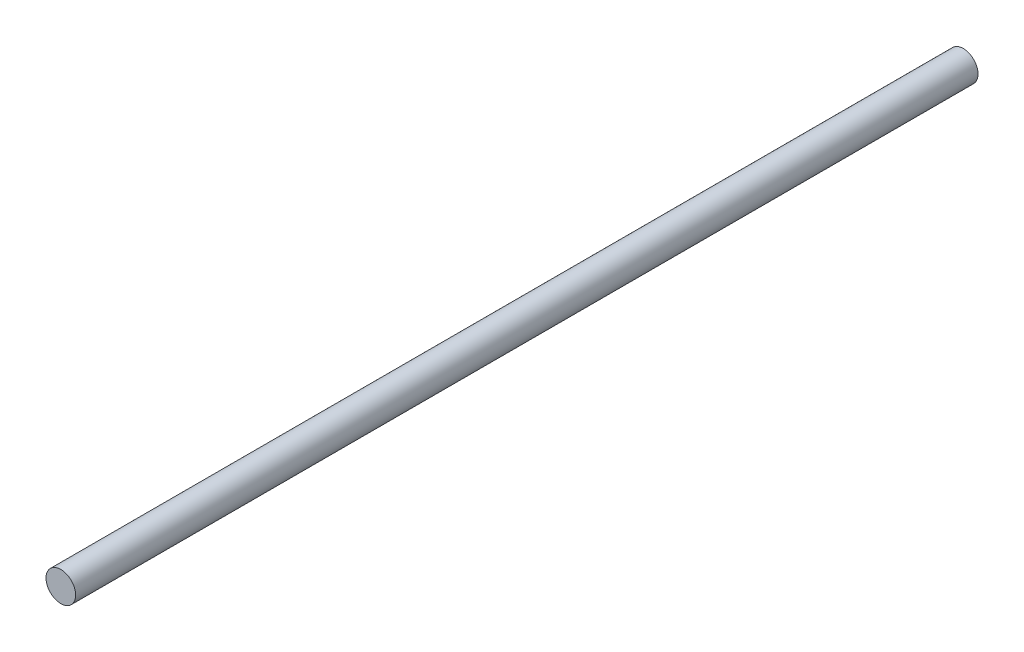
ISO-10303-21;
HEADER;
FILE_DESCRIPTION(('STEP AP214'),'2;1');
FILE_NAME('part.step','',(''),(''),'','','');
FILE_SCHEMA(('AUTOMOTIVE_DESIGN { 1 0 10303 214 1 1 1 1 }'));
ENDSEC;
DATA;
#1=APPLICATION_CONTEXT('core data for automotive mechanical design processes');
#2=APPLICATION_PROTOCOL_DEFINITION('international standard','automotive_design',2000,#1);
#3=PRODUCT_CONTEXT('',#1,'mechanical');
#4=PRODUCT('Part','Part','',(#3));
#5=PRODUCT_RELATED_PRODUCT_CATEGORY('part','',(#4));
#6=PRODUCT_DEFINITION_FORMATION('','',#4);
#7=PRODUCT_DEFINITION_CONTEXT('part definition',#1,'design');
#8=PRODUCT_DEFINITION('design','',#6,#7);
#9=PRODUCT_DEFINITION_SHAPE('','',#8);
#10=(LENGTH_UNIT() NAMED_UNIT(*) SI_UNIT(.MILLI.,.METRE.));
#11=(NAMED_UNIT(*) PLANE_ANGLE_UNIT() SI_UNIT($,.RADIAN.));
#12=(NAMED_UNIT(*) SI_UNIT($,.STERADIAN.) SOLID_ANGLE_UNIT());
#13=UNCERTAINTY_MEASURE_WITH_UNIT(LENGTH_MEASURE(1.E-05),#10,'distance_accuracy_value','');
#14=(GEOMETRIC_REPRESENTATION_CONTEXT(3) GLOBAL_UNCERTAINTY_ASSIGNED_CONTEXT((#13)) GLOBAL_UNIT_ASSIGNED_CONTEXT((#10,
#11,#12)) REPRESENTATION_CONTEXT('',''));
#15=CARTESIAN_POINT('',(0.,0.,0.));
#16=DIRECTION('',(0.,0.,1.));
#17=DIRECTION('',(1.,0.,0.));
#18=AXIS2_PLACEMENT_3D('',#15,#16,#17);
#19=CARTESIAN_POINT('',(0.,0.,91.4));
#20=DIRECTION('',(0.,0.,-1.));
#21=DIRECTION('',(-1.,0.,0.));
#22=AXIS2_PLACEMENT_3D('',#19,#20,#21);
#23=CYLINDRICAL_SURFACE('',#22,1.5);
#24=CARTESIAN_POINT('',(0.,0.,91.4));
#25=DIRECTION('',(0.,0.,1.));
#26=DIRECTION('',(1.,0.,0.));
#27=AXIS2_PLACEMENT_3D('',#24,#25,#26);
#28=CIRCLE('',#27,1.5);
#29=CARTESIAN_POINT('',(-1.5,0.,91.4));
#30=VERTEX_POINT('',#29);
#31=EDGE_CURVE('E10',#30,#30,#28,.T.);
#32=CARTESIAN_POINT('',(0.,0.,0.));
#33=DIRECTION('',(0.,0.,1.));
#34=DIRECTION('',(1.,0.,0.));
#35=AXIS2_PLACEMENT_3D('',#32,#33,#34);
#36=CIRCLE('',#35,1.5);
#37=CARTESIAN_POINT('',(-1.5,0.,0.));
#38=VERTEX_POINT('',#37);
#39=EDGE_CURVE('E46',#38,#38,#36,.T.);
#40=CARTESIAN_POINT('',(-1.5,0.,91.4));
#41=CARTESIAN_POINT('',(-1.5,0.,90.4479166666667));
#42=CARTESIAN_POINT('',(-1.5,0.,89.4958333333333));
#43=CARTESIAN_POINT('',(-1.5,0.,87.5916666666667));
#44=CARTESIAN_POINT('',(-1.5,0.,86.6395833333333));
#45=CARTESIAN_POINT('',(-1.5,0.,84.7354166666667));
#46=CARTESIAN_POINT('',(-1.5,0.,83.7833333333333));
#47=CARTESIAN_POINT('',(-1.5,0.,81.8791666666667));
#48=CARTESIAN_POINT('',(-1.5,0.,80.9270833333333));
#49=CARTESIAN_POINT('',(-1.5,0.,79.0229166666667));
#50=CARTESIAN_POINT('',(-1.5,0.,78.0708333333333));
#51=CARTESIAN_POINT('',(-1.5,0.,76.1666666666667));
#52=CARTESIAN_POINT('',(-1.5,0.,75.2145833333333));
#53=CARTESIAN_POINT('',(-1.5,0.,73.3104166666667));
#54=CARTESIAN_POINT('',(-1.5,0.,72.3583333333333));
#55=CARTESIAN_POINT('',(-1.5,0.,70.4541666666667));
#56=CARTESIAN_POINT('',(-1.5,0.,69.5020833333333));
#57=CARTESIAN_POINT('',(-1.5,0.,67.5979166666667));
#58=CARTESIAN_POINT('',(-1.5,0.,66.6458333333333));
#59=CARTESIAN_POINT('',(-1.5,0.,64.7416666666667));
#60=CARTESIAN_POINT('',(-1.5,0.,63.7895833333333));
#61=CARTESIAN_POINT('',(-1.5,0.,61.8854166666667));
#62=CARTESIAN_POINT('',(-1.5,0.,60.9333333333333));
#63=CARTESIAN_POINT('',(-1.5,0.,59.0291666666667));
#64=CARTESIAN_POINT('',(-1.5,0.,58.0770833333333));
#65=CARTESIAN_POINT('',(-1.5,0.,56.1729166666667));
#66=CARTESIAN_POINT('',(-1.5,0.,55.2208333333333));
#67=CARTESIAN_POINT('',(-1.5,0.,53.3166666666667));
#68=CARTESIAN_POINT('',(-1.5,0.,52.3645833333333));
#69=CARTESIAN_POINT('',(-1.5,0.,50.4604166666667));
#70=CARTESIAN_POINT('',(-1.5,0.,49.5083333333333));
#71=CARTESIAN_POINT('',(-1.5,0.,47.6041666666667));
#72=CARTESIAN_POINT('',(-1.5,0.,46.6520833333333));
#73=CARTESIAN_POINT('',(-1.5,0.,44.7479166666667));
#74=CARTESIAN_POINT('',(-1.5,0.,43.7958333333333));
#75=CARTESIAN_POINT('',(-1.5,0.,41.8916666666667));
#76=CARTESIAN_POINT('',(-1.5,0.,40.9395833333333));
#77=CARTESIAN_POINT('',(-1.5,0.,39.0354166666667));
#78=CARTESIAN_POINT('',(-1.5,0.,38.0833333333333));
#79=CARTESIAN_POINT('',(-1.5,0.,36.1791666666667));
#80=CARTESIAN_POINT('',(-1.5,0.,35.2270833333333));
#81=CARTESIAN_POINT('',(-1.5,0.,33.3229166666667));
#82=CARTESIAN_POINT('',(-1.5,0.,32.3708333333333));
#83=CARTESIAN_POINT('',(-1.5,0.,30.4666666666667));
#84=CARTESIAN_POINT('',(-1.5,0.,29.5145833333333));
#85=CARTESIAN_POINT('',(-1.5,0.,27.6104166666667));
#86=CARTESIAN_POINT('',(-1.5,0.,26.6583333333333));
#87=CARTESIAN_POINT('',(-1.5,0.,24.7541666666667));
#88=CARTESIAN_POINT('',(-1.5,0.,23.8020833333333));
#89=CARTESIAN_POINT('',(-1.5,0.,21.8979166666667));
#90=CARTESIAN_POINT('',(-1.5,0.,20.9458333333333));
#91=CARTESIAN_POINT('',(-1.5,0.,19.0416666666667));
#92=CARTESIAN_POINT('',(-1.5,0.,18.0895833333333));
#93=CARTESIAN_POINT('',(-1.5,0.,16.1854166666667));
#94=CARTESIAN_POINT('',(-1.5,0.,15.2333333333333));
#95=CARTESIAN_POINT('',(-1.5,0.,13.3291666666667));
#96=CARTESIAN_POINT('',(-1.5,0.,12.3770833333333));
#97=CARTESIAN_POINT('',(-1.5,0.,10.4729166666667));
#98=CARTESIAN_POINT('',(-1.5,0.,9.52083333333332));
#99=CARTESIAN_POINT('',(-1.5,0.,7.61666666666665));
#100=CARTESIAN_POINT('',(-1.5,0.,6.66458333333332));
#101=CARTESIAN_POINT('',(-1.5,0.,4.76041666666665));
#102=CARTESIAN_POINT('',(-1.5,0.,3.80833333333332));
#103=CARTESIAN_POINT('',(-1.5,0.,1.90416666666666));
#104=CARTESIAN_POINT('',(-1.5,0.,0.952083333333321));
#105=CARTESIAN_POINT('',(-1.5,0.,0.));
#106=B_SPLINE_CURVE_WITH_KNOTS('',3,(#40,#41,#42,#43,#44,#45,#46,#47,#48,#49,#50,#51,#52,#53,
#54,#55,#56,#57,#58,#59,#60,#61,#62,#63,#64,#65,#66,#67,#68,#69,#70,#71,#72,#73,#74,#75,#76,#77,
#78,#79,#80,#81,#82,#83,#84,#85,#86,#87,#88,#89,#90,#91,#92,#93,#94,#95,#96,#97,#98,#99,#100,
#101,#102,#103,#104,#105),.UNSPECIFIED.,.F.,.F.,(4,2,2,2,2,2,2,2,2,2,2,2,2,2,2,2,2,2,2,2,2,2,2,
2,2,2,2,2,2,2,2,2,4),(0.,2.85624999999999,5.7125,8.56875,11.425,14.28125,17.1375,19.99375,22.85,
25.70625,28.5625,31.41875,34.275,37.13125,39.9875,42.84375,45.7,48.55625,51.4125,54.26875,
57.125,59.98125,62.8375,65.69375,68.55,71.40625,74.2625,77.11875,79.975,82.83125,85.6875,
88.54375,91.4),.UNSPECIFIED.);
#107=EDGE_CURVE('BSEAM43',#30,#38,#106,.T.);
#108=ORIENTED_EDGE('',*,*,#31,.F.);
#109=ORIENTED_EDGE('',*,*,#39,.T.);
#110=ORIENTED_EDGE('',*,*,#107,.T.);
#111=ORIENTED_EDGE('',*,*,#107,.F.);
#112=EDGE_LOOP('',(#108,#110,#109,#111));
#113=FACE_BOUND('',#112,.T.);
#114=ADVANCED_FACE('F43',(#113),#23,.T.);
#115=CARTESIAN_POINT('',(0.,0.,91.4));
#116=DIRECTION('',(0.,0.,1.));
#117=DIRECTION('',(1.,0.,0.));
#118=AXIS2_PLACEMENT_3D('',#115,#116,#117);
#119=PLANE('',#118);
#120=ORIENTED_EDGE('',*,*,#31,.T.);
#121=EDGE_LOOP('',(#120));
#122=FACE_BOUND('',#121,.T.);
#123=ADVANCED_FACE('F60',(#122),#119,.T.);
#124=CARTESIAN_POINT('',(0.,0.,0.));
#125=DIRECTION('',(0.,0.,1.));
#126=DIRECTION('',(1.,0.,0.));
#127=AXIS2_PLACEMENT_3D('',#124,#125,#126);
#128=PLANE('',#127);
#129=ORIENTED_EDGE('',*,*,#39,.F.);
#130=EDGE_LOOP('',(#129));
#131=FACE_BOUND('',#130,.T.);
#132=ADVANCED_FACE('F58',(#131),#128,.F.);
#133=CLOSED_SHELL('',(#114,#123,#132));
#134=MANIFOLD_SOLID_BREP('B2',#133);
#135=ADVANCED_BREP_SHAPE_REPRESENTATION('',(#18,#134),#14);
#136=SHAPE_DEFINITION_REPRESENTATION(#9,#135);
ENDSEC;
END-ISO-10303-21;
